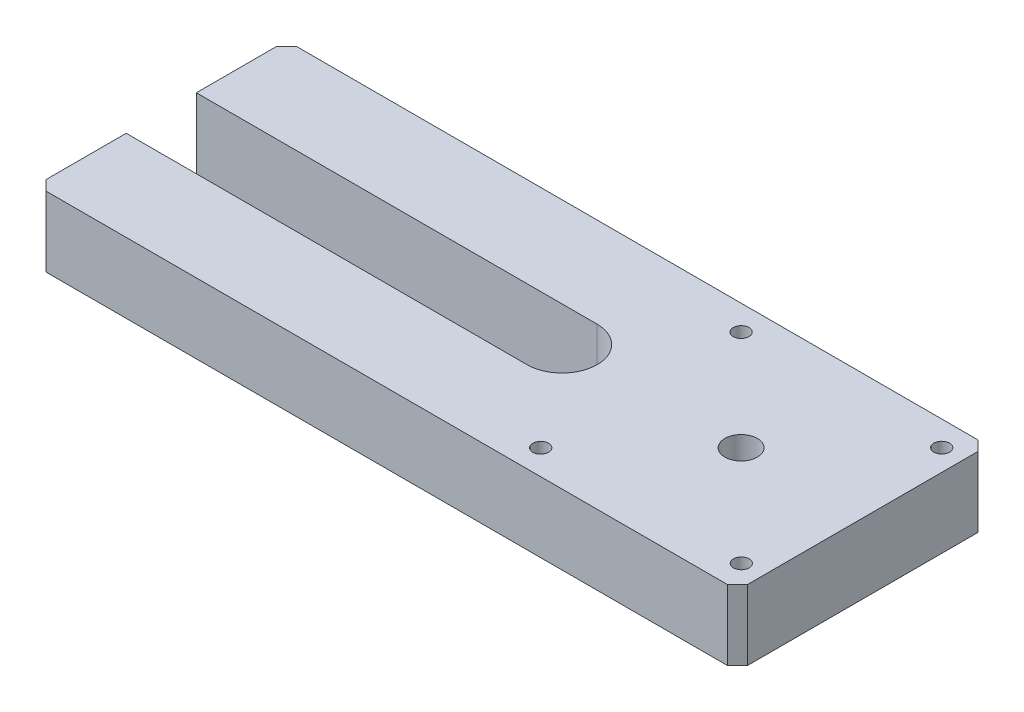
ISO-10303-21;
HEADER;
FILE_DESCRIPTION(('STEP AP214'),'2;1');
FILE_NAME('part.step','',(''),(''),'','','');
FILE_SCHEMA(('AUTOMOTIVE_DESIGN { 1 0 10303 214 1 1 1 1 }'));
ENDSEC;
DATA;
#1=APPLICATION_CONTEXT('core data for automotive mechanical design processes');
#2=APPLICATION_PROTOCOL_DEFINITION('international standard','automotive_design',2000,#1);
#3=PRODUCT_CONTEXT('',#1,'mechanical');
#4=PRODUCT('Part','Part','',(#3));
#5=PRODUCT_RELATED_PRODUCT_CATEGORY('part','',(#4));
#6=PRODUCT_DEFINITION_FORMATION('','',#4);
#7=PRODUCT_DEFINITION_CONTEXT('part definition',#1,'design');
#8=PRODUCT_DEFINITION('design','',#6,#7);
#9=PRODUCT_DEFINITION_SHAPE('','',#8);
#10=(LENGTH_UNIT() NAMED_UNIT(*) SI_UNIT(.MILLI.,.METRE.));
#11=(NAMED_UNIT(*) PLANE_ANGLE_UNIT() SI_UNIT($,.RADIAN.));
#12=(NAMED_UNIT(*) SI_UNIT($,.STERADIAN.) SOLID_ANGLE_UNIT());
#13=UNCERTAINTY_MEASURE_WITH_UNIT(LENGTH_MEASURE(1.E-05),#10,'distance_accuracy_value','');
#14=(GEOMETRIC_REPRESENTATION_CONTEXT(3) GLOBAL_UNCERTAINTY_ASSIGNED_CONTEXT((#13)) GLOBAL_UNIT_ASSIGNED_CONTEXT((#10,
#11,#12)) REPRESENTATION_CONTEXT('',''));
#15=CARTESIAN_POINT('',(0.,0.,0.));
#16=DIRECTION('',(0.,0.,1.));
#17=DIRECTION('',(1.,0.,0.));
#18=AXIS2_PLACEMENT_3D('',#15,#16,#17);
#19=CARTESIAN_POINT('',(-0.997020561473036,7.,-24.0029794385271));
#20=DIRECTION('',(1.,0.,0.));
#21=DIRECTION('',(0.,0.,-1.));
#22=AXIS2_PLACEMENT_3D('',#19,#20,#21);
#23=PLANE('',#22);
#24=DIRECTION('',(0.,0.,1.));
#25=VECTOR('',#24,1.);
#26=CARTESIAN_POINT('',(-0.997020561473036,0.,-24.0029794385271));
#27=LINE('',#26,#25);
#28=CARTESIAN_POINT('',(-0.997020561473036,0.,-24.0029794385271));
#29=VERTEX_POINT('',#28);
#30=CARTESIAN_POINT('',(-0.997020561473036,0.,-16.0000000000001));
#31=VERTEX_POINT('',#30);
#32=EDGE_CURVE('E168',#29,#31,#27,.T.);
#33=ORIENTED_EDGE('',*,*,#32,.T.);
#34=DIRECTION('',(0.,1.,0.));
#35=VECTOR('',#34,1.);
#36=CARTESIAN_POINT('',(-0.997020561473036,0.,-16.0000000000001));
#37=LINE('',#36,#35);
#38=CARTESIAN_POINT('',(-0.997020561473036,7.,-16.0000000000001));
#39=VERTEX_POINT('',#38);
#40=EDGE_CURVE('E233',#31,#39,#37,.T.);
#41=ORIENTED_EDGE('',*,*,#40,.T.);
#42=DIRECTION('',(0.,0.,1.));
#43=VECTOR('',#42,1.);
#44=CARTESIAN_POINT('',(-0.997020561473036,7.,-24.0029794385271));
#45=LINE('',#44,#43);
#46=CARTESIAN_POINT('',(-0.997020561473036,7.,-24.0029794385271));
#47=VERTEX_POINT('',#46);
#48=EDGE_CURVE('E148',#47,#39,#45,.T.);
#49=ORIENTED_EDGE('',*,*,#48,.F.);
#50=DIRECTION('',(0.,-1.,0.));
#51=VECTOR('',#50,1.);
#52=CARTESIAN_POINT('',(-0.997020561473036,7.,-24.0029794385271));
#53=LINE('',#52,#51);
#54=EDGE_CURVE('E142',#47,#29,#53,.T.);
#55=ORIENTED_EDGE('',*,*,#54,.T.);
#56=EDGE_LOOP('',(#33,#41,#49,#55));
#57=FACE_BOUND('',#56,.T.);
#58=ADVANCED_FACE('F38',(#57),#23,.F.);
#59=CARTESIAN_POINT('',(0.,7.,0.));
#60=DIRECTION('',(0.,1.,0.));
#61=DIRECTION('',(0.,0.,1.));
#62=AXIS2_PLACEMENT_3D('',#59,#60,#61);
#63=PLANE('',#62);
#64=DIRECTION('',(-1.,0.,0.));
#65=VECTOR('',#64,1.);
#66=CARTESIAN_POINT('',(-0.997020561473036,7.,-16.0000000000001));
#67=LINE('',#66,#65);
#68=CARTESIAN_POINT('',(39.002979438527,7.,-16.0000000000001));
#69=VERTEX_POINT('',#68);
#70=EDGE_CURVE('E247',#69,#39,#67,.T.);
#71=ORIENTED_EDGE('',*,*,#70,.F.);
#72=CARTESIAN_POINT('',(39.002979438527,7.,-12.5000000000001));
#73=DIRECTION('',(0.,1.,0.));
#74=DIRECTION('',(0.,0.,1.));
#75=AXIS2_PLACEMENT_3D('',#72,#73,#74);
#76=CIRCLE('',#75,3.5);
#77=CARTESIAN_POINT('',(39.002979438527,7.,-9.00000000000007));
#78=VERTEX_POINT('',#77);
#79=EDGE_CURVE('E250',#78,#69,#76,.T.);
#80=ORIENTED_EDGE('',*,*,#79,.F.);
#81=DIRECTION('',(1.,0.,0.));
#82=VECTOR('',#81,1.);
#83=CARTESIAN_POINT('',(-0.997020561473036,7.,-9.00000000000007));
#84=LINE('',#83,#82);
#85=CARTESIAN_POINT('',(-0.997020561473036,7.,-9.00000000000007));
#86=VERTEX_POINT('',#85);
#87=EDGE_CURVE('E253',#86,#78,#84,.T.);
#88=ORIENTED_EDGE('',*,*,#87,.F.);
#89=CARTESIAN_POINT('',(-0.997020561473037,7.,-0.997020561473032));
#90=VERTEX_POINT('',#89);
#91=EDGE_CURVE('E62',#86,#90,#45,.T.);
#92=ORIENTED_EDGE('',*,*,#91,.T.);
#93=DIRECTION('',(0.707106781186549,0.,0.707106781186546));
#94=VECTOR('',#93,1.);
#95=CARTESIAN_POINT('',(-0.997020561473037,7.,-0.997020561473032));
#96=LINE('',#95,#94);
#97=CARTESIAN_POINT('',(0.,7.,0.));
#98=VERTEX_POINT('',#97);
#99=EDGE_CURVE('E171',#90,#98,#96,.T.);
#100=ORIENTED_EDGE('',*,*,#99,.T.);
#101=DIRECTION('',(1.,0.,0.));
#102=VECTOR('',#101,1.);
#103=CARTESIAN_POINT('',(0.,7.,0.));
#104=LINE('',#103,#102);
#105=CARTESIAN_POINT('',(68.005958877054,7.,0.));
#106=VERTEX_POINT('',#105);
#107=EDGE_CURVE('E103',#98,#106,#104,.T.);
#108=ORIENTED_EDGE('',*,*,#107,.T.);
#109=DIRECTION('',(0.707106781186548,0.,-0.707106781186547));
#110=VECTOR('',#109,1.);
#111=CARTESIAN_POINT('',(68.005958877054,7.,0.));
#112=LINE('',#111,#110);
#113=CARTESIAN_POINT('',(69.002979438527,7.,-0.997020561473021));
#114=VERTEX_POINT('',#113);
#115=EDGE_CURVE('E186',#106,#114,#112,.T.);
#116=ORIENTED_EDGE('',*,*,#115,.T.);
#117=DIRECTION('',(0.,0.,-1.));
#118=VECTOR('',#117,1.);
#119=CARTESIAN_POINT('',(69.002979438527,7.,-0.997020561473021));
#120=LINE('',#119,#118);
#121=CARTESIAN_POINT('',(69.002979438527,7.,-24.002979438527));
#122=VERTEX_POINT('',#121);
#123=EDGE_CURVE('E200',#114,#122,#120,.T.);
#124=ORIENTED_EDGE('',*,*,#123,.T.);
#125=DIRECTION('',(-0.707106781186548,0.,-0.707106781186548));
#126=VECTOR('',#125,1.);
#127=CARTESIAN_POINT('',(69.002979438527,7.,-24.002979438527));
#128=LINE('',#127,#126);
#129=CARTESIAN_POINT('',(68.005958877054,7.,-25.));
#130=VERTEX_POINT('',#129);
#131=EDGE_CURVE('E129',#122,#130,#128,.T.);
#132=ORIENTED_EDGE('',*,*,#131,.T.);
#133=DIRECTION('',(-1.,0.,0.));
#134=VECTOR('',#133,1.);
#135=CARTESIAN_POINT('',(68.005958877054,7.,-25.));
#136=LINE('',#135,#134);
#137=CARTESIAN_POINT('',(0.,7.,-25.0000000000001));
#138=VERTEX_POINT('',#137);
#139=EDGE_CURVE('E119',#130,#138,#136,.T.);
#140=ORIENTED_EDGE('',*,*,#139,.T.);
#141=DIRECTION('',(-0.70710678118658,0.,0.707106781186515));
#142=VECTOR('',#141,1.);
#143=CARTESIAN_POINT('',(0.,7.,-25.0000000000001));
#144=LINE('',#143,#142);
#145=EDGE_CURVE('E126',#138,#47,#144,.T.);
#146=ORIENTED_EDGE('',*,*,#145,.T.);
#147=ORIENTED_EDGE('',*,*,#48,.T.);
#148=EDGE_LOOP('',(#71,#80,#88,#92,#100,#108,#116,#124,#132,#140,#146,#147));
#149=FACE_BOUND('',#148,.T.);
#150=CARTESIAN_POINT('',(66.865958877054,7.,-2.52075067746511));
#151=DIRECTION('',(0.,1.,0.));
#152=DIRECTION('',(0.,0.,1.));
#153=AXIS2_PLACEMENT_3D('',#150,#151,#152);
#154=CIRCLE('',#153,0.784999999999993);
#155=CARTESIAN_POINT('',(66.865958877054,7.,-1.73575067746511));
#156=VERTEX_POINT('',#155);
#157=EDGE_CURVE('E221',#156,#156,#154,.T.);
#158=ORIENTED_EDGE('',*,*,#157,.F.);
#159=EDGE_LOOP('',(#158));
#160=FACE_BOUND('',#159,.T.);
#161=CARTESIAN_POINT('',(46.865958877054,7.,-2.50000000000003));
#162=DIRECTION('',(0.,1.,0.));
#163=DIRECTION('',(0.,0.,1.));
#164=AXIS2_PLACEMENT_3D('',#161,#162,#163);
#165=CIRCLE('',#164,0.785000000000001);
#166=CARTESIAN_POINT('',(46.865958877054,7.,-1.71500000000003));
#167=VERTEX_POINT('',#166);
#168=EDGE_CURVE('E209',#167,#167,#165,.T.);
#169=ORIENTED_EDGE('',*,*,#168,.F.);
#170=EDGE_LOOP('',(#169));
#171=FACE_BOUND('',#170,.T.);
#172=CARTESIAN_POINT('',(46.865958877054,7.,-22.5));
#173=DIRECTION('',(0.,1.,0.));
#174=DIRECTION('',(0.,0.,1.));
#175=AXIS2_PLACEMENT_3D('',#172,#173,#174);
#176=CIRCLE('',#175,0.785);
#177=CARTESIAN_POINT('',(46.865958877054,7.,-21.715));
#178=VERTEX_POINT('',#177);
#179=EDGE_CURVE('E157',#178,#178,#176,.T.);
#180=ORIENTED_EDGE('',*,*,#179,.F.);
#181=EDGE_LOOP('',(#180));
#182=FACE_BOUND('',#181,.T.);
#183=CARTESIAN_POINT('',(56.865958877054,7.,-12.5000000000001));
#184=DIRECTION('',(0.,1.,0.));
#185=DIRECTION('',(0.,0.,1.));
#186=AXIS2_PLACEMENT_3D('',#183,#184,#185);
#187=CIRCLE('',#186,1.62000000000001);
#188=CARTESIAN_POINT('',(56.865958877054,7.,-10.8800000000001));
#189=VERTEX_POINT('',#188);
#190=EDGE_CURVE('E215',#189,#189,#187,.T.);
#191=ORIENTED_EDGE('',*,*,#190,.F.);
#192=EDGE_LOOP('',(#191));
#193=FACE_BOUND('',#192,.T.);
#194=CARTESIAN_POINT('',(66.865958877054,7.,-22.5207506774652));
#195=DIRECTION('',(0.,1.,0.));
#196=DIRECTION('',(0.,0.,1.));
#197=AXIS2_PLACEMENT_3D('',#194,#195,#196);
#198=CIRCLE('',#197,0.784999999999994);
#199=CARTESIAN_POINT('',(66.865958877054,7.,-21.7357506774652));
#200=VERTEX_POINT('',#199);
#201=EDGE_CURVE('E227',#200,#200,#198,.T.);
#202=ORIENTED_EDGE('',*,*,#201,.F.);
#203=EDGE_LOOP('',(#202));
#204=FACE_BOUND('',#203,.T.);
#205=ADVANCED_FACE('F122',(#149,#160,#171,#182,#193,#204),#63,.T.);
#206=CARTESIAN_POINT('',(0.,0.,0.));
#207=DIRECTION('',(0.,1.,0.));
#208=DIRECTION('',(0.,0.,1.));
#209=AXIS2_PLACEMENT_3D('',#206,#207,#208);
#210=PLANE('',#209);
#211=CARTESIAN_POINT('',(39.002979438527,0.,-12.5000000000001));
#212=DIRECTION('',(0.,1.,0.));
#213=DIRECTION('',(0.,0.,1.));
#214=AXIS2_PLACEMENT_3D('',#211,#212,#213);
#215=CIRCLE('',#214,3.5);
#216=CARTESIAN_POINT('',(39.002979438527,0.,-9.00000000000007));
#217=VERTEX_POINT('',#216);
#218=CARTESIAN_POINT('',(39.002979438527,0.,-16.0000000000001));
#219=VERTEX_POINT('',#218);
#220=EDGE_CURVE('E258',#217,#219,#215,.T.);
#221=ORIENTED_EDGE('',*,*,#220,.T.);
#222=DIRECTION('',(-1.,0.,0.));
#223=VECTOR('',#222,1.);
#224=CARTESIAN_POINT('',(-0.997020561473036,0.,-16.0000000000001));
#225=LINE('',#224,#223);
#226=EDGE_CURVE('E239',#219,#31,#225,.T.);
#227=ORIENTED_EDGE('',*,*,#226,.T.);
#228=ORIENTED_EDGE('',*,*,#32,.F.);
#229=DIRECTION('',(-0.70710678118658,0.,0.707106781186515));
#230=VECTOR('',#229,1.);
#231=CARTESIAN_POINT('',(0.,0.,-25.0000000000001));
#232=LINE('',#231,#230);
#233=CARTESIAN_POINT('',(0.,0.,-25.0000000000001));
#234=VERTEX_POINT('',#233);
#235=EDGE_CURVE('E166',#234,#29,#232,.T.);
#236=ORIENTED_EDGE('',*,*,#235,.F.);
#237=DIRECTION('',(-1.,0.,0.));
#238=VECTOR('',#237,1.);
#239=CARTESIAN_POINT('',(68.005958877054,0.,-25.));
#240=LINE('',#239,#238);
#241=CARTESIAN_POINT('',(68.005958877054,0.,-25.));
#242=VERTEX_POINT('',#241);
#243=EDGE_CURVE('E138',#242,#234,#240,.T.);
#244=ORIENTED_EDGE('',*,*,#243,.F.);
#245=DIRECTION('',(-0.707106781186548,0.,-0.707106781186548));
#246=VECTOR('',#245,1.);
#247=CARTESIAN_POINT('',(69.002979438527,0.,-24.002979438527));
#248=LINE('',#247,#246);
#249=CARTESIAN_POINT('',(69.002979438527,0.,-24.002979438527));
#250=VERTEX_POINT('',#249);
#251=EDGE_CURVE('E163',#250,#242,#248,.T.);
#252=ORIENTED_EDGE('',*,*,#251,.F.);
#253=DIRECTION('',(0.,0.,-1.));
#254=VECTOR('',#253,1.);
#255=CARTESIAN_POINT('',(69.002979438527,0.,-0.997020561473021));
#256=LINE('',#255,#254);
#257=CARTESIAN_POINT('',(69.002979438527,0.,-0.997020561473021));
#258=VERTEX_POINT('',#257);
#259=EDGE_CURVE('E161',#258,#250,#256,.T.);
#260=ORIENTED_EDGE('',*,*,#259,.F.);
#261=DIRECTION('',(0.707106781186548,0.,-0.707106781186547));
#262=VECTOR('',#261,1.);
#263=CARTESIAN_POINT('',(68.005958877054,0.,0.));
#264=LINE('',#263,#262);
#265=CARTESIAN_POINT('',(68.005958877054,0.,0.));
#266=VERTEX_POINT('',#265);
#267=EDGE_CURVE('E159',#266,#258,#264,.T.);
#268=ORIENTED_EDGE('',*,*,#267,.F.);
#269=DIRECTION('',(1.,0.,0.));
#270=VECTOR('',#269,1.);
#271=CARTESIAN_POINT('',(0.,0.,0.));
#272=LINE('',#271,#270);
#273=CARTESIAN_POINT('',(0.,0.,0.));
#274=VERTEX_POINT('',#273);
#275=EDGE_CURVE('E156',#274,#266,#272,.T.);
#276=ORIENTED_EDGE('',*,*,#275,.F.);
#277=DIRECTION('',(0.707106781186549,0.,0.707106781186546));
#278=VECTOR('',#277,1.);
#279=CARTESIAN_POINT('',(-0.997020561473037,0.,-0.997020561473032));
#280=LINE('',#279,#278);
#281=CARTESIAN_POINT('',(-0.997020561473037,0.,-0.997020561473032));
#282=VERTEX_POINT('',#281);
#283=EDGE_CURVE('E153',#282,#274,#280,.T.);
#284=ORIENTED_EDGE('',*,*,#283,.F.);
#285=CARTESIAN_POINT('',(-0.997020561473037,0.,-9.00000000000007));
#286=VERTEX_POINT('',#285);
#287=EDGE_CURVE('E95',#286,#282,#27,.T.);
#288=ORIENTED_EDGE('',*,*,#287,.F.);
#289=DIRECTION('',(1.,0.,0.));
#290=VECTOR('',#289,1.);
#291=CARTESIAN_POINT('',(-0.997020561473036,0.,-9.00000000000007));
#292=LINE('',#291,#290);
#293=EDGE_CURVE('E53',#286,#217,#292,.T.);
#294=ORIENTED_EDGE('',*,*,#293,.T.);
#295=EDGE_LOOP('',(#221,#227,#228,#236,#244,#252,#260,#268,#276,#284,#288,#294));
#296=FACE_BOUND('',#295,.T.);
#297=CARTESIAN_POINT('',(46.865958877054,0.,-22.5));
#298=DIRECTION('',(0.,1.,0.));
#299=DIRECTION('',(0.,0.,1.));
#300=AXIS2_PLACEMENT_3D('',#297,#298,#299);
#301=CIRCLE('',#300,0.785);
#302=CARTESIAN_POINT('',(46.865958877054,0.,-21.715));
#303=VERTEX_POINT('',#302);
#304=EDGE_CURVE('E206',#303,#303,#301,.T.);
#305=ORIENTED_EDGE('',*,*,#304,.T.);
#306=EDGE_LOOP('',(#305));
#307=FACE_BOUND('',#306,.T.);
#308=CARTESIAN_POINT('',(46.865958877054,0.,-2.50000000000003));
#309=DIRECTION('',(0.,1.,0.));
#310=DIRECTION('',(0.,0.,1.));
#311=AXIS2_PLACEMENT_3D('',#308,#309,#310);
#312=CIRCLE('',#311,0.785000000000001);
#313=CARTESIAN_POINT('',(46.865958877054,0.,-1.71500000000003));
#314=VERTEX_POINT('',#313);
#315=EDGE_CURVE('E212',#314,#314,#312,.T.);
#316=ORIENTED_EDGE('',*,*,#315,.T.);
#317=EDGE_LOOP('',(#316));
#318=FACE_BOUND('',#317,.T.);
#319=CARTESIAN_POINT('',(56.865958877054,0.,-12.5000000000001));
#320=DIRECTION('',(0.,1.,0.));
#321=DIRECTION('',(0.,0.,1.));
#322=AXIS2_PLACEMENT_3D('',#319,#320,#321);
#323=CIRCLE('',#322,1.62000000000001);
#324=CARTESIAN_POINT('',(56.865958877054,0.,-10.8800000000001));
#325=VERTEX_POINT('',#324);
#326=EDGE_CURVE('E218',#325,#325,#323,.T.);
#327=ORIENTED_EDGE('',*,*,#326,.T.);
#328=EDGE_LOOP('',(#327));
#329=FACE_BOUND('',#328,.T.);
#330=CARTESIAN_POINT('',(66.865958877054,0.,-2.52075067746511));
#331=DIRECTION('',(0.,1.,0.));
#332=DIRECTION('',(0.,0.,1.));
#333=AXIS2_PLACEMENT_3D('',#330,#331,#332);
#334=CIRCLE('',#333,0.784999999999993);
#335=CARTESIAN_POINT('',(66.865958877054,0.,-1.73575067746511));
#336=VERTEX_POINT('',#335);
#337=EDGE_CURVE('E224',#336,#336,#334,.T.);
#338=ORIENTED_EDGE('',*,*,#337,.T.);
#339=EDGE_LOOP('',(#338));
#340=FACE_BOUND('',#339,.T.);
#341=CARTESIAN_POINT('',(66.865958877054,0.,-22.5207506774652));
#342=DIRECTION('',(0.,1.,0.));
#343=DIRECTION('',(0.,0.,1.));
#344=AXIS2_PLACEMENT_3D('',#341,#342,#343);
#345=CIRCLE('',#344,0.784999999999994);
#346=CARTESIAN_POINT('',(66.865958877054,0.,-21.7357506774652));
#347=VERTEX_POINT('',#346);
#348=EDGE_CURVE('E230',#347,#347,#345,.T.);
#349=ORIENTED_EDGE('',*,*,#348,.T.);
#350=EDGE_LOOP('',(#349));
#351=FACE_BOUND('',#350,.T.);
#352=ADVANCED_FACE('F190',(#296,#307,#318,#329,#340,#351),#210,.F.);
#353=CARTESIAN_POINT('',(-0.997020561473037,7.,-0.997020561473032));
#354=DIRECTION('',(0.707106781186546,0.,-0.707106781186549));
#355=DIRECTION('',(-0.707106781186549,0.,-0.707106781186546));
#356=AXIS2_PLACEMENT_3D('',#353,#354,#355);
#357=PLANE('',#356);
#358=ORIENTED_EDGE('',*,*,#283,.T.);
#359=DIRECTION('',(0.,-1.,0.));
#360=VECTOR('',#359,1.);
#361=CARTESIAN_POINT('',(0.,7.,0.));
#362=LINE('',#361,#360);
#363=EDGE_CURVE('E11',#98,#274,#362,.T.);
#364=ORIENTED_EDGE('',*,*,#363,.F.);
#365=ORIENTED_EDGE('',*,*,#99,.F.);
#366=DIRECTION('',(0.,-1.,0.));
#367=VECTOR('',#366,1.);
#368=CARTESIAN_POINT('',(-0.997020561473037,7.,-0.997020561473032));
#369=LINE('',#368,#367);
#370=EDGE_CURVE('E152',#90,#282,#369,.T.);
#371=ORIENTED_EDGE('',*,*,#370,.T.);
#372=EDGE_LOOP('',(#358,#364,#365,#371));
#373=FACE_BOUND('',#372,.T.);
#374=ADVANCED_FACE('F40',(#373),#357,.F.);
#375=CARTESIAN_POINT('',(0.,7.,0.));
#376=DIRECTION('',(0.,0.,-1.));
#377=DIRECTION('',(-1.,0.,0.));
#378=AXIS2_PLACEMENT_3D('',#375,#376,#377);
#379=PLANE('',#378);
#380=ORIENTED_EDGE('',*,*,#275,.T.);
#381=DIRECTION('',(0.,-1.,0.));
#382=VECTOR('',#381,1.);
#383=CARTESIAN_POINT('',(68.005958877054,7.,0.));
#384=LINE('',#383,#382);
#385=EDGE_CURVE('E46',#106,#266,#384,.T.);
#386=ORIENTED_EDGE('',*,*,#385,.F.);
#387=ORIENTED_EDGE('',*,*,#107,.F.);
#388=ORIENTED_EDGE('',*,*,#363,.T.);
#389=EDGE_LOOP('',(#380,#386,#387,#388));
#390=FACE_BOUND('',#389,.T.);
#391=ADVANCED_FACE('F302',(#390),#379,.F.);
#392=CARTESIAN_POINT('',(68.005958877054,7.,0.));
#393=DIRECTION('',(-0.707106781186547,0.,-0.707106781186548));
#394=DIRECTION('',(-0.707106781186548,0.,0.707106781186547));
#395=AXIS2_PLACEMENT_3D('',#392,#393,#394);
#396=PLANE('',#395);
#397=ORIENTED_EDGE('',*,*,#267,.T.);
#398=DIRECTION('',(0.,-1.,0.));
#399=VECTOR('',#398,1.);
#400=CARTESIAN_POINT('',(69.002979438527,7.,-0.997020561473021));
#401=LINE('',#400,#399);
#402=EDGE_CURVE('E178',#114,#258,#401,.T.);
#403=ORIENTED_EDGE('',*,*,#402,.F.);
#404=ORIENTED_EDGE('',*,*,#115,.F.);
#405=ORIENTED_EDGE('',*,*,#385,.T.);
#406=EDGE_LOOP('',(#397,#403,#404,#405));
#407=FACE_BOUND('',#406,.T.);
#408=ADVANCED_FACE('F184',(#407),#396,.F.);
#409=CARTESIAN_POINT('',(69.002979438527,7.,-0.997020561473021));
#410=DIRECTION('',(-1.,0.,0.));
#411=DIRECTION('',(0.,0.,1.));
#412=AXIS2_PLACEMENT_3D('',#409,#410,#411);
#413=PLANE('',#412);
#414=ORIENTED_EDGE('',*,*,#259,.T.);
#415=DIRECTION('',(0.,-1.,0.));
#416=VECTOR('',#415,1.);
#417=CARTESIAN_POINT('',(69.002979438527,7.,-24.002979438527));
#418=LINE('',#417,#416);
#419=EDGE_CURVE('E175',#122,#250,#418,.T.);
#420=ORIENTED_EDGE('',*,*,#419,.F.);
#421=ORIENTED_EDGE('',*,*,#123,.F.);
#422=ORIENTED_EDGE('',*,*,#402,.T.);
#423=EDGE_LOOP('',(#414,#420,#421,#422));
#424=FACE_BOUND('',#423,.T.);
#425=ADVANCED_FACE('F196',(#424),#413,.F.);
#426=CARTESIAN_POINT('',(69.002979438527,7.,-24.002979438527));
#427=DIRECTION('',(-0.707106781186547,0.,0.707106781186547));
#428=DIRECTION('',(0.707106781186548,0.,0.707106781186548));
#429=AXIS2_PLACEMENT_3D('',#426,#427,#428);
#430=PLANE('',#429);
#431=ORIENTED_EDGE('',*,*,#251,.T.);
#432=DIRECTION('',(0.,-1.,0.));
#433=VECTOR('',#432,1.);
#434=CARTESIAN_POINT('',(68.005958877054,7.,-25.));
#435=LINE('',#434,#433);
#436=EDGE_CURVE('E141',#130,#242,#435,.T.);
#437=ORIENTED_EDGE('',*,*,#436,.F.);
#438=ORIENTED_EDGE('',*,*,#131,.F.);
#439=ORIENTED_EDGE('',*,*,#419,.T.);
#440=EDGE_LOOP('',(#431,#437,#438,#439));
#441=FACE_BOUND('',#440,.T.);
#442=ADVANCED_FACE('F199',(#441),#430,.F.);
#443=CARTESIAN_POINT('',(68.005958877054,7.,-25.));
#444=DIRECTION('',(0.,0.,1.));
#445=DIRECTION('',(1.,0.,0.));
#446=AXIS2_PLACEMENT_3D('',#443,#444,#445);
#447=PLANE('',#446);
#448=ORIENTED_EDGE('',*,*,#243,.T.);
#449=DIRECTION('',(0.,-1.,0.));
#450=VECTOR('',#449,1.);
#451=CARTESIAN_POINT('',(0.,7.,-25.0000000000001));
#452=LINE('',#451,#450);
#453=EDGE_CURVE('E135',#138,#234,#452,.T.);
#454=ORIENTED_EDGE('',*,*,#453,.F.);
#455=ORIENTED_EDGE('',*,*,#139,.F.);
#456=ORIENTED_EDGE('',*,*,#436,.T.);
#457=EDGE_LOOP('',(#448,#454,#455,#456));
#458=FACE_BOUND('',#457,.T.);
#459=ADVANCED_FACE('F136',(#458),#447,.F.);
#460=CARTESIAN_POINT('',(0.,7.,-25.0000000000001));
#461=DIRECTION('',(0.707106781186516,0.,0.70710678118658));
#462=DIRECTION('',(0.70710678118658,0.,-0.707106781186516));
#463=AXIS2_PLACEMENT_3D('',#460,#461,#462);
#464=PLANE('',#463);
#465=ORIENTED_EDGE('',*,*,#235,.T.);
#466=ORIENTED_EDGE('',*,*,#54,.F.);
#467=ORIENTED_EDGE('',*,*,#145,.F.);
#468=ORIENTED_EDGE('',*,*,#453,.T.);
#469=EDGE_LOOP('',(#465,#466,#467,#468));
#470=FACE_BOUND('',#469,.T.);
#471=ADVANCED_FACE('F144',(#470),#464,.F.);
#472=ORIENTED_EDGE('',*,*,#91,.F.);
#473=DIRECTION('',(0.,1.,0.));
#474=VECTOR('',#473,1.);
#475=CARTESIAN_POINT('',(-0.997020561473036,0.,-9.00000000000007));
#476=LINE('',#475,#474);
#477=EDGE_CURVE('E236',#286,#86,#476,.T.);
#478=ORIENTED_EDGE('',*,*,#477,.F.);
#479=ORIENTED_EDGE('',*,*,#287,.T.);
#480=ORIENTED_EDGE('',*,*,#370,.F.);
#481=EDGE_LOOP('',(#472,#478,#479,#480));
#482=FACE_BOUND('',#481,.T.);
#483=ADVANCED_FACE('F283',(#482),#23,.F.);
#484=CARTESIAN_POINT('',(46.865958877054,7.,-22.5));
#485=DIRECTION('',(0.,-1.,0.));
#486=DIRECTION('',(0.,0.,-1.));
#487=AXIS2_PLACEMENT_3D('',#484,#485,#486);
#488=CYLINDRICAL_SURFACE('',#487,0.785);
#489=ORIENTED_EDGE('',*,*,#179,.T.);
#490=EDGE_LOOP('',(#489));
#491=FACE_BOUND('',#490,.T.);
#492=ORIENTED_EDGE('',*,*,#304,.F.);
#493=EDGE_LOOP('',(#492));
#494=FACE_BOUND('',#493,.T.);
#495=ADVANCED_FACE('F291',(#491,#494),#488,.F.);
#496=CARTESIAN_POINT('',(46.865958877054,7.,-2.50000000000003));
#497=DIRECTION('',(0.,-1.,0.));
#498=DIRECTION('',(0.,0.,-1.));
#499=AXIS2_PLACEMENT_3D('',#496,#497,#498);
#500=CYLINDRICAL_SURFACE('',#499,0.785000000000001);
#501=ORIENTED_EDGE('',*,*,#168,.T.);
#502=EDGE_LOOP('',(#501));
#503=FACE_BOUND('',#502,.T.);
#504=ORIENTED_EDGE('',*,*,#315,.F.);
#505=EDGE_LOOP('',(#504));
#506=FACE_BOUND('',#505,.T.);
#507=ADVANCED_FACE('F296',(#503,#506),#500,.F.);
#508=CARTESIAN_POINT('',(56.865958877054,7.,-12.5000000000001));
#509=DIRECTION('',(0.,-1.,0.));
#510=DIRECTION('',(0.,0.,-1.));
#511=AXIS2_PLACEMENT_3D('',#508,#509,#510);
#512=CYLINDRICAL_SURFACE('',#511,1.62000000000001);
#513=ORIENTED_EDGE('',*,*,#190,.T.);
#514=EDGE_LOOP('',(#513));
#515=FACE_BOUND('',#514,.T.);
#516=ORIENTED_EDGE('',*,*,#326,.F.);
#517=EDGE_LOOP('',(#516));
#518=FACE_BOUND('',#517,.T.);
#519=ADVANCED_FACE('F341',(#515,#518),#512,.F.);
#520=CARTESIAN_POINT('',(66.865958877054,7.,-2.52075067746511));
#521=DIRECTION('',(0.,-1.,0.));
#522=DIRECTION('',(0.,0.,-1.));
#523=AXIS2_PLACEMENT_3D('',#520,#521,#522);
#524=CYLINDRICAL_SURFACE('',#523,0.784999999999993);
#525=ORIENTED_EDGE('',*,*,#157,.T.);
#526=EDGE_LOOP('',(#525));
#527=FACE_BOUND('',#526,.T.);
#528=ORIENTED_EDGE('',*,*,#337,.F.);
#529=EDGE_LOOP('',(#528));
#530=FACE_BOUND('',#529,.T.);
#531=ADVANCED_FACE('F352',(#527,#530),#524,.F.);
#532=CARTESIAN_POINT('',(66.865958877054,7.,-22.5207506774652));
#533=DIRECTION('',(0.,-1.,0.));
#534=DIRECTION('',(0.,0.,-1.));
#535=AXIS2_PLACEMENT_3D('',#532,#533,#534);
#536=CYLINDRICAL_SURFACE('',#535,0.784999999999994);
#537=ORIENTED_EDGE('',*,*,#201,.T.);
#538=EDGE_LOOP('',(#537));
#539=FACE_BOUND('',#538,.T.);
#540=ORIENTED_EDGE('',*,*,#348,.F.);
#541=EDGE_LOOP('',(#540));
#542=FACE_BOUND('',#541,.T.);
#543=ADVANCED_FACE('F363',(#539,#542),#536,.F.);
#544=CARTESIAN_POINT('',(-0.997020561473036,0.,-16.0000000000001));
#545=DIRECTION('',(0.,0.,-1.));
#546=DIRECTION('',(-1.,0.,0.));
#547=AXIS2_PLACEMENT_3D('',#544,#545,#546);
#548=PLANE('',#547);
#549=ORIENTED_EDGE('',*,*,#70,.T.);
#550=ORIENTED_EDGE('',*,*,#40,.F.);
#551=ORIENTED_EDGE('',*,*,#226,.F.);
#552=DIRECTION('',(0.,1.,0.));
#553=VECTOR('',#552,1.);
#554=CARTESIAN_POINT('',(39.002979438527,0.,-16.0000000000001));
#555=LINE('',#554,#553);
#556=EDGE_CURVE('E242',#219,#69,#555,.T.);
#557=ORIENTED_EDGE('',*,*,#556,.T.);
#558=EDGE_LOOP('',(#549,#550,#551,#557));
#559=FACE_BOUND('',#558,.T.);
#560=ADVANCED_FACE('F275',(#559),#548,.F.);
#561=CARTESIAN_POINT('',(39.002979438527,0.,-12.5000000000001));
#562=DIRECTION('',(0.,1.,0.));
#563=DIRECTION('',(0.,0.,1.));
#564=AXIS2_PLACEMENT_3D('',#561,#562,#563);
#565=CYLINDRICAL_SURFACE('',#564,3.5);
#566=ORIENTED_EDGE('',*,*,#79,.T.);
#567=ORIENTED_EDGE('',*,*,#556,.F.);
#568=ORIENTED_EDGE('',*,*,#220,.F.);
#569=DIRECTION('',(0.,1.,0.));
#570=VECTOR('',#569,1.);
#571=CARTESIAN_POINT('',(39.002979438527,0.,-9.00000000000007));
#572=LINE('',#571,#570);
#573=EDGE_CURVE('E238',#217,#78,#572,.T.);
#574=ORIENTED_EDGE('',*,*,#573,.T.);
#575=EDGE_LOOP('',(#566,#567,#568,#574));
#576=FACE_BOUND('',#575,.T.);
#577=ADVANCED_FACE('F278',(#576),#565,.F.);
#578=CARTESIAN_POINT('',(-0.997020561473036,0.,-9.00000000000007));
#579=DIRECTION('',(0.,0.,1.));
#580=DIRECTION('',(1.,0.,0.));
#581=AXIS2_PLACEMENT_3D('',#578,#579,#580);
#582=PLANE('',#581);
#583=ORIENTED_EDGE('',*,*,#87,.T.);
#584=ORIENTED_EDGE('',*,*,#573,.F.);
#585=ORIENTED_EDGE('',*,*,#293,.F.);
#586=ORIENTED_EDGE('',*,*,#477,.T.);
#587=EDGE_LOOP('',(#583,#584,#585,#586));
#588=FACE_BOUND('',#587,.T.);
#589=ADVANCED_FACE('F417',(#588),#582,.F.);
#590=CLOSED_SHELL('',(#58,#205,#352,#374,#391,#408,#425,#442,#459,#471,#483,#495,#507,#519,#531,
#543,#560,#577,#589));
#591=MANIFOLD_SOLID_BREP('B2',#590);
#592=ADVANCED_BREP_SHAPE_REPRESENTATION('',(#18,#591),#14);
#593=SHAPE_DEFINITION_REPRESENTATION(#9,#592);
ENDSEC;
END-ISO-10303-21;
